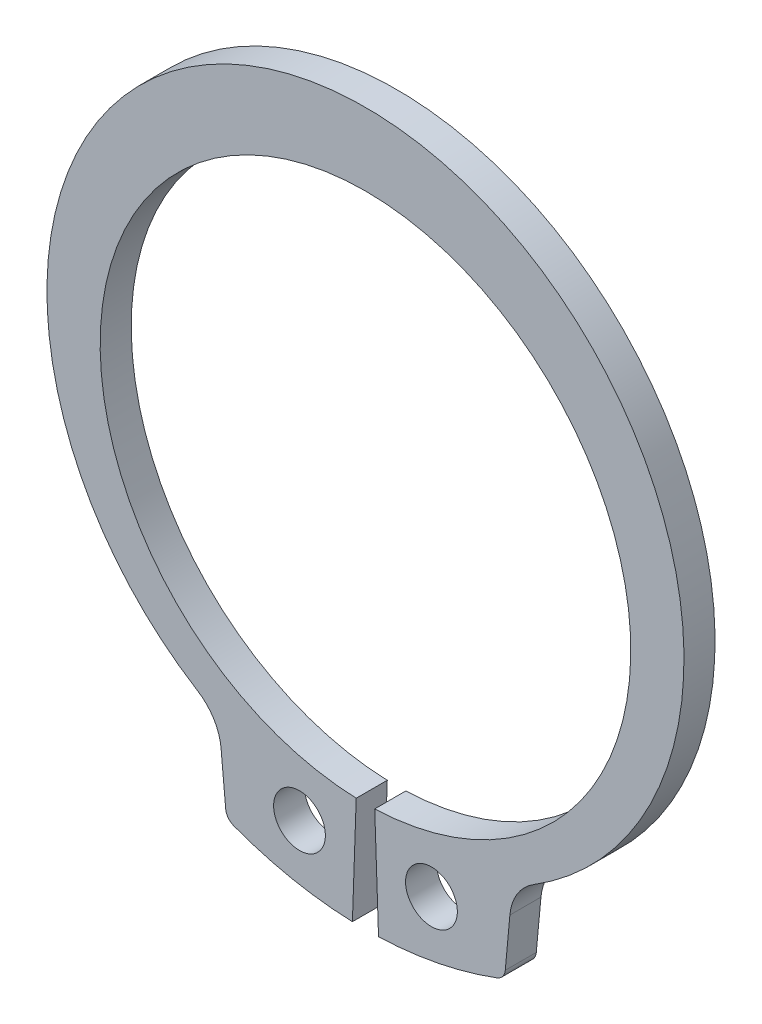
ISO-10303-21;
HEADER;
FILE_DESCRIPTION(('STEP AP214'),'2;1');
FILE_NAME('part.step','',(''),(''),'','','');
FILE_SCHEMA(('AUTOMOTIVE_DESIGN { 1 0 10303 214 1 1 1 1 }'));
ENDSEC;
DATA;
#1=APPLICATION_CONTEXT('core data for automotive mechanical design processes');
#2=APPLICATION_PROTOCOL_DEFINITION('international standard','automotive_design',2000,#1);
#3=PRODUCT_CONTEXT('',#1,'mechanical');
#4=PRODUCT('Part','Part','',(#3));
#5=PRODUCT_RELATED_PRODUCT_CATEGORY('part','',(#4));
#6=PRODUCT_DEFINITION_FORMATION('','',#4);
#7=PRODUCT_DEFINITION_CONTEXT('part definition',#1,'design');
#8=PRODUCT_DEFINITION('design','',#6,#7);
#9=PRODUCT_DEFINITION_SHAPE('','',#8);
#10=(LENGTH_UNIT() NAMED_UNIT(*) SI_UNIT(.MILLI.,.METRE.));
#11=(NAMED_UNIT(*) PLANE_ANGLE_UNIT() SI_UNIT($,.RADIAN.));
#12=(NAMED_UNIT(*) SI_UNIT($,.STERADIAN.) SOLID_ANGLE_UNIT());
#13=UNCERTAINTY_MEASURE_WITH_UNIT(LENGTH_MEASURE(1.E-05),#10,'distance_accuracy_value','');
#14=(GEOMETRIC_REPRESENTATION_CONTEXT(3) GLOBAL_UNCERTAINTY_ASSIGNED_CONTEXT((#13)) GLOBAL_UNIT_ASSIGNED_CONTEXT((#10,
#11,#12)) REPRESENTATION_CONTEXT('',''));
#15=CARTESIAN_POINT('',(0.,0.,0.));
#16=DIRECTION('',(0.,0.,1.));
#17=DIRECTION('',(1.,0.,0.));
#18=AXIS2_PLACEMENT_3D('',#15,#16,#17);
#19=CARTESIAN_POINT('',(0.,0.744411940032271,0.6));
#20=DIRECTION('',(0.,0.,1.));
#21=DIRECTION('',(1.,0.,0.));
#22=AXIS2_PLACEMENT_3D('',#19,#20,#21);
#23=PLANE('',#22);
#24=DIRECTION('',(0.0915748319668036,-0.995798197503014,0.));
#25=VECTOR('',#24,1.);
#26=CARTESIAN_POINT('',(-5.37268796446974,-13.4235371777606,0.6));
#27=LINE('',#26,#25);
#28=CARTESIAN_POINT('',(-5.57851751730511,-11.185316333625,0.6));
#29=VERTEX_POINT('',#28);
#30=CARTESIAN_POINT('',(-5.40026241330544,-13.1236885637039,0.6));
#31=VERTEX_POINT('',#30);
#32=EDGE_CURVE('E218',#29,#31,#27,.T.);
#33=ORIENTED_EDGE('',*,*,#32,.T.);
#34=CARTESIAN_POINT('',(-4.91603415482012,-13.0791583350736,0.6));
#35=DIRECTION('',(0.,0.,1.));
#36=DIRECTION('',(1.,0.,0.));
#37=AXIS2_PLACEMENT_3D('',#34,#35,#36);
#38=CIRCLE('',#37,0.486271475183956);
#39=CARTESIAN_POINT('',(-5.08712171582207,-13.5343385126385,0.6));
#40=VERTEX_POINT('',#39);
#41=EDGE_CURVE('E12',#31,#40,#38,.T.);
#42=ORIENTED_EDGE('',*,*,#41,.T.);
#43=CARTESIAN_POINT('',(0.,0.,0.6));
#44=DIRECTION('',(0.,0.,1.));
#45=DIRECTION('',(1.,0.,0.));
#46=AXIS2_PLACEMENT_3D('',#43,#44,#45);
#47=CIRCLE('',#46,14.458807915118);
#48=CARTESIAN_POINT('',(-0.504605119155777,-14.45,0.6));
#49=VERTEX_POINT('',#48);
#50=EDGE_CURVE('E222',#40,#49,#47,.T.);
#51=ORIENTED_EDGE('',*,*,#50,.T.);
#52=DIRECTION('',(0.0348994967025028,0.999390827019096,0.));
#53=VECTOR('',#52,1.);
#54=CARTESIAN_POINT('',(-0.504605119155777,-14.45,0.6));
#55=LINE('',#54,#53);
#56=CARTESIAN_POINT('',(-0.357719841200651,-10.2437559769457,0.6));
#57=VERTEX_POINT('',#56);
#58=EDGE_CURVE('E225',#49,#57,#55,.T.);
#59=ORIENTED_EDGE('',*,*,#58,.T.);
#60=CARTESIAN_POINT('',(0.,0.,0.6));
#61=DIRECTION('',(0.,0.,-1.));
#62=DIRECTION('',(1.,0.,0.));
#63=AXIS2_PLACEMENT_3D('',#60,#61,#62);
#64=CIRCLE('',#63,10.25);
#65=CARTESIAN_POINT('',(0.357719841200645,-10.2437559769457,0.6));
#66=VERTEX_POINT('',#65);
#67=EDGE_CURVE('E160',#57,#66,#64,.T.);
#68=ORIENTED_EDGE('',*,*,#67,.T.);
#69=DIRECTION('',(-0.0348994967025023,0.999390827019096,0.));
#70=VECTOR('',#69,1.);
#71=CARTESIAN_POINT('',(0.50460511915577,-14.45,0.6));
#72=LINE('',#71,#70);
#73=CARTESIAN_POINT('',(0.50460511915577,-14.45,0.6));
#74=VERTEX_POINT('',#73);
#75=EDGE_CURVE('E138',#74,#66,#72,.T.);
#76=ORIENTED_EDGE('',*,*,#75,.F.);
#77=CARTESIAN_POINT('',(0.,0.,0.6));
#78=DIRECTION('',(0.,0.,-1.));
#79=DIRECTION('',(-1.,0.,0.));
#80=AXIS2_PLACEMENT_3D('',#77,#78,#79);
#81=CIRCLE('',#80,14.458807915118);
#82=CARTESIAN_POINT('',(5.08712171582206,-13.5343385126385,0.6));
#83=VERTEX_POINT('',#82);
#84=EDGE_CURVE('E149',#83,#74,#81,.T.);
#85=ORIENTED_EDGE('',*,*,#84,.F.);
#86=CARTESIAN_POINT('',(4.91603415482012,-13.0791583350736,0.6));
#87=DIRECTION('',(0.,0.,-1.));
#88=DIRECTION('',(-1.,0.,0.));
#89=AXIS2_PLACEMENT_3D('',#86,#87,#88);
#90=CIRCLE('',#89,0.486271475183956);
#91=CARTESIAN_POINT('',(5.40026241330543,-13.1236885637039,0.6));
#92=VERTEX_POINT('',#91);
#93=EDGE_CURVE('E202',#92,#83,#90,.T.);
#94=ORIENTED_EDGE('',*,*,#93,.F.);
#95=DIRECTION('',(-0.0915748319668042,-0.995798197503014,0.));
#96=VECTOR('',#95,1.);
#97=CARTESIAN_POINT('',(5.37268796446974,-13.4235371777606,0.6));
#98=LINE('',#97,#96);
#99=CARTESIAN_POINT('',(5.5785175173051,-11.185316333625,0.6));
#100=VERTEX_POINT('',#99);
#101=EDGE_CURVE('E156',#100,#92,#98,.T.);
#102=ORIENTED_EDGE('',*,*,#101,.F.);
#103=CARTESIAN_POINT('',(7.51543055124636,-11.3634372481459,0.6));
#104=DIRECTION('',(0.,0.,-1.));
#105=DIRECTION('',(-1.,0.,0.));
#106=AXIS2_PLACEMENT_3D('',#103,#104,#105);
#107=CIRCLE('',#106,1.94508590073582);
#108=CARTESIAN_POINT('',(6.48964341700286,-9.71082721657109,0.6));
#109=VERTEX_POINT('',#108);
#110=EDGE_CURVE('E189',#109,#100,#107,.F.);
#111=ORIENTED_EDGE('',*,*,#110,.F.);
#112=CARTESIAN_POINT('',(0.,0.744411940032271,0.6));
#113=DIRECTION('',(0.,0.,1.));
#114=DIRECTION('',(1.,0.,0.));
#115=AXIS2_PLACEMENT_3D('',#112,#113,#114);
#116=CIRCLE('',#115,12.3055880599677);
#117=CARTESIAN_POINT('',(-6.48964341700287,-9.71082721657108,0.6));
#118=VERTEX_POINT('',#117);
#119=EDGE_CURVE('E214',#109,#118,#116,.T.);
#120=ORIENTED_EDGE('',*,*,#119,.T.);
#121=CARTESIAN_POINT('',(-7.51543055124637,-11.3634372481459,0.6));
#122=DIRECTION('',(0.,0.,1.));
#123=DIRECTION('',(1.,0.,0.));
#124=AXIS2_PLACEMENT_3D('',#121,#122,#123);
#125=CIRCLE('',#124,1.94508590073582);
#126=EDGE_CURVE('E262',#118,#29,#125,.F.);
#127=ORIENTED_EDGE('',*,*,#126,.T.);
#128=EDGE_LOOP('',(#33,#42,#51,#59,#68,#76,#85,#94,#102,#111,#120,#127));
#129=FACE_BOUND('',#128,.T.);
#130=CARTESIAN_POINT('',(-2.54894891922943,-12.0885961365954,0.6));
#131=DIRECTION('',(0.,0.,1.));
#132=DIRECTION('',(1.,0.,0.));
#133=AXIS2_PLACEMENT_3D('',#130,#131,#132);
#134=CIRCLE('',#133,1.);
#135=CARTESIAN_POINT('',(-1.54894891922942,-12.0885961365954,0.6));
#136=VERTEX_POINT('',#135);
#137=EDGE_CURVE('E206',#136,#136,#134,.T.);
#138=ORIENTED_EDGE('',*,*,#137,.F.);
#139=EDGE_LOOP('',(#138));
#140=FACE_BOUND('',#139,.T.);
#141=CARTESIAN_POINT('',(2.54894891922942,-12.0885961365954,0.6));
#142=DIRECTION('',(0.,0.,-1.));
#143=DIRECTION('',(-1.,0.,0.));
#144=AXIS2_PLACEMENT_3D('',#141,#142,#143);
#145=CIRCLE('',#144,1.);
#146=CARTESIAN_POINT('',(1.54894891922942,-12.0885961365954,0.6));
#147=VERTEX_POINT('',#146);
#148=EDGE_CURVE('E174',#147,#147,#145,.T.);
#149=ORIENTED_EDGE('',*,*,#148,.T.);
#150=EDGE_LOOP('',(#149));
#151=FACE_BOUND('',#150,.T.);
#152=ADVANCED_FACE('F43',(#129,#140,#151),#23,.T.);
#153=CARTESIAN_POINT('',(0.,0.744411940032271,-0.6));
#154=DIRECTION('',(0.,0.,1.));
#155=DIRECTION('',(1.,0.,0.));
#156=AXIS2_PLACEMENT_3D('',#153,#154,#155);
#157=PLANE('',#156);
#158=CARTESIAN_POINT('',(0.,0.,-0.6));
#159=DIRECTION('',(0.,0.,1.));
#160=DIRECTION('',(1.,0.,0.));
#161=AXIS2_PLACEMENT_3D('',#158,#159,#160);
#162=CIRCLE('',#161,14.458807915118);
#163=CARTESIAN_POINT('',(-5.08712171582207,-13.5343385126385,-0.6));
#164=VERTEX_POINT('',#163);
#165=CARTESIAN_POINT('',(-0.504605119155777,-14.45,-0.6));
#166=VERTEX_POINT('',#165);
#167=EDGE_CURVE('E237',#164,#166,#162,.T.);
#168=ORIENTED_EDGE('',*,*,#167,.F.);
#169=CARTESIAN_POINT('',(-4.91603415482012,-13.0791583350736,-0.6));
#170=DIRECTION('',(0.,0.,1.));
#171=DIRECTION('',(1.,0.,0.));
#172=AXIS2_PLACEMENT_3D('',#169,#170,#171);
#173=CIRCLE('',#172,0.486271475183956);
#174=CARTESIAN_POINT('',(-5.40026241330544,-13.1236885637039,-0.6));
#175=VERTEX_POINT('',#174);
#176=EDGE_CURVE('E66',#164,#175,#173,.F.);
#177=ORIENTED_EDGE('',*,*,#176,.T.);
#178=DIRECTION('',(0.0915748319668036,-0.995798197503014,0.));
#179=VECTOR('',#178,1.);
#180=CARTESIAN_POINT('',(-5.37268796446974,-13.4235371777606,-0.6));
#181=LINE('',#180,#179);
#182=CARTESIAN_POINT('',(-5.57851751730511,-11.185316333625,-0.6));
#183=VERTEX_POINT('',#182);
#184=EDGE_CURVE('E234',#183,#175,#181,.T.);
#185=ORIENTED_EDGE('',*,*,#184,.F.);
#186=CARTESIAN_POINT('',(-7.51543055124637,-11.3634372481459,-0.6));
#187=DIRECTION('',(0.,0.,1.));
#188=DIRECTION('',(1.,0.,0.));
#189=AXIS2_PLACEMENT_3D('',#186,#187,#188);
#190=CIRCLE('',#189,1.94508590073582);
#191=CARTESIAN_POINT('',(-6.48964341700287,-9.71082721657108,-0.6));
#192=VERTEX_POINT('',#191);
#193=EDGE_CURVE('E259',#183,#192,#190,.T.);
#194=ORIENTED_EDGE('',*,*,#193,.T.);
#195=CARTESIAN_POINT('',(0.,0.744411940032271,-0.6));
#196=DIRECTION('',(0.,0.,1.));
#197=DIRECTION('',(1.,0.,0.));
#198=AXIS2_PLACEMENT_3D('',#195,#196,#197);
#199=CIRCLE('',#198,12.3055880599677);
#200=CARTESIAN_POINT('',(6.48964341700286,-9.71082721657109,-0.6));
#201=VERTEX_POINT('',#200);
#202=EDGE_CURVE('E210',#201,#192,#199,.T.);
#203=ORIENTED_EDGE('',*,*,#202,.F.);
#204=CARTESIAN_POINT('',(7.51543055124636,-11.3634372481459,-0.6));
#205=DIRECTION('',(0.,0.,-1.));
#206=DIRECTION('',(-1.,0.,0.));
#207=AXIS2_PLACEMENT_3D('',#204,#205,#206);
#208=CIRCLE('',#207,1.94508590073582);
#209=CARTESIAN_POINT('',(5.5785175173051,-11.185316333625,-0.6));
#210=VERTEX_POINT('',#209);
#211=EDGE_CURVE('E185',#210,#201,#208,.T.);
#212=ORIENTED_EDGE('',*,*,#211,.F.);
#213=DIRECTION('',(-0.0915748319668042,-0.995798197503014,0.));
#214=VECTOR('',#213,1.);
#215=CARTESIAN_POINT('',(5.37268796446974,-13.4235371777606,-0.6));
#216=LINE('',#215,#214);
#217=CARTESIAN_POINT('',(5.40026241330543,-13.1236885637039,-0.6));
#218=VERTEX_POINT('',#217);
#219=EDGE_CURVE('E169',#210,#218,#216,.T.);
#220=ORIENTED_EDGE('',*,*,#219,.T.);
#221=CARTESIAN_POINT('',(4.91603415482012,-13.0791583350736,-0.6));
#222=DIRECTION('',(0.,0.,-1.));
#223=DIRECTION('',(-1.,0.,0.));
#224=AXIS2_PLACEMENT_3D('',#221,#222,#223);
#225=CIRCLE('',#224,0.486271475183956);
#226=CARTESIAN_POINT('',(5.08712171582206,-13.5343385126385,-0.6));
#227=VERTEX_POINT('',#226);
#228=EDGE_CURVE('E195',#227,#218,#225,.F.);
#229=ORIENTED_EDGE('',*,*,#228,.F.);
#230=CARTESIAN_POINT('',(0.,0.,-0.6));
#231=DIRECTION('',(0.,0.,-1.));
#232=DIRECTION('',(-1.,0.,0.));
#233=AXIS2_PLACEMENT_3D('',#230,#231,#232);
#234=CIRCLE('',#233,14.458807915118);
#235=CARTESIAN_POINT('',(0.50460511915577,-14.45,-0.6));
#236=VERTEX_POINT('',#235);
#237=EDGE_CURVE('E173',#227,#236,#234,.T.);
#238=ORIENTED_EDGE('',*,*,#237,.T.);
#239=DIRECTION('',(-0.0348994967025023,0.999390827019096,0.));
#240=VECTOR('',#239,1.);
#241=CARTESIAN_POINT('',(0.50460511915577,-14.45,-0.6));
#242=LINE('',#241,#240);
#243=CARTESIAN_POINT('',(0.357719841200645,-10.2437559769457,-0.6));
#244=VERTEX_POINT('',#243);
#245=EDGE_CURVE('E140',#236,#244,#242,.T.);
#246=ORIENTED_EDGE('',*,*,#245,.T.);
#247=CARTESIAN_POINT('',(0.,0.,-0.6));
#248=DIRECTION('',(0.,0.,-1.));
#249=DIRECTION('',(1.,0.,0.));
#250=AXIS2_PLACEMENT_3D('',#247,#248,#249);
#251=CIRCLE('',#250,10.25);
#252=CARTESIAN_POINT('',(-0.357719841200651,-10.2437559769457,-0.6));
#253=VERTEX_POINT('',#252);
#254=EDGE_CURVE('E219',#253,#244,#251,.T.);
#255=ORIENTED_EDGE('',*,*,#254,.F.);
#256=DIRECTION('',(0.0348994967025028,0.999390827019096,0.));
#257=VECTOR('',#256,1.);
#258=CARTESIAN_POINT('',(-0.504605119155777,-14.45,-0.6));
#259=LINE('',#258,#257);
#260=EDGE_CURVE('E240',#166,#253,#259,.T.);
#261=ORIENTED_EDGE('',*,*,#260,.F.);
#262=EDGE_LOOP('',(#168,#177,#185,#194,#203,#212,#220,#229,#238,#246,#255,#261));
#263=FACE_BOUND('',#262,.T.);
#264=CARTESIAN_POINT('',(-2.54894891922943,-12.0885961365954,-0.6));
#265=DIRECTION('',(0.,0.,1.));
#266=DIRECTION('',(1.,0.,0.));
#267=AXIS2_PLACEMENT_3D('',#264,#265,#266);
#268=CIRCLE('',#267,1.);
#269=CARTESIAN_POINT('',(-1.54894891922942,-12.0885961365954,-0.6));
#270=VERTEX_POINT('',#269);
#271=EDGE_CURVE('E205',#270,#270,#268,.T.);
#272=ORIENTED_EDGE('',*,*,#271,.T.);
#273=EDGE_LOOP('',(#272));
#274=FACE_BOUND('',#273,.T.);
#275=CARTESIAN_POINT('',(2.54894891922942,-12.0885961365954,-0.6));
#276=DIRECTION('',(0.,0.,-1.));
#277=DIRECTION('',(-1.,0.,0.));
#278=AXIS2_PLACEMENT_3D('',#275,#276,#277);
#279=CIRCLE('',#278,1.);
#280=CARTESIAN_POINT('',(1.54894891922942,-12.0885961365954,-0.6));
#281=VERTEX_POINT('',#280);
#282=EDGE_CURVE('E333',#281,#281,#279,.T.);
#283=ORIENTED_EDGE('',*,*,#282,.F.);
#284=EDGE_LOOP('',(#283));
#285=FACE_BOUND('',#284,.T.);
#286=ADVANCED_FACE('F311',(#263,#274,#285),#157,.F.);
#287=CARTESIAN_POINT('',(0.,0.744411940032271,0.6));
#288=DIRECTION('',(0.,0.,-1.));
#289=DIRECTION('',(-1.,0.,0.));
#290=AXIS2_PLACEMENT_3D('',#287,#288,#289);
#291=CYLINDRICAL_SURFACE('',#290,12.3055880599677);
#292=ORIENTED_EDGE('',*,*,#202,.T.);
#293=DIRECTION('',(0.,0.,-1.));
#294=VECTOR('',#293,1.);
#295=CARTESIAN_POINT('',(-6.48964341700287,-9.71082721657108,0.6));
#296=LINE('',#295,#294);
#297=EDGE_CURVE('E256',#192,#118,#296,.F.);
#298=ORIENTED_EDGE('',*,*,#297,.T.);
#299=ORIENTED_EDGE('',*,*,#119,.F.);
#300=DIRECTION('',(0.,0.,-1.));
#301=VECTOR('',#300,1.);
#302=CARTESIAN_POINT('',(6.48964341700286,-9.71082721657109,0.6));
#303=LINE('',#302,#301);
#304=EDGE_CURVE('E181',#201,#109,#303,.F.);
#305=ORIENTED_EDGE('',*,*,#304,.F.);
#306=EDGE_LOOP('',(#292,#298,#299,#305));
#307=FACE_BOUND('',#306,.T.);
#308=ADVANCED_FACE('F351',(#307),#291,.T.);
#309=CARTESIAN_POINT('',(-5.37268796446974,-13.4235371777606,0.6));
#310=DIRECTION('',(0.995798197503014,0.0915748319668036,0.));
#311=DIRECTION('',(-0.0915748319668036,0.995798197503014,0.));
#312=AXIS2_PLACEMENT_3D('',#309,#310,#311);
#313=PLANE('',#312);
#314=ORIENTED_EDGE('',*,*,#184,.T.);
#315=DIRECTION('',(0.,0.,-1.));
#316=VECTOR('',#315,1.);
#317=CARTESIAN_POINT('',(-5.40026241330544,-13.1236885637039,0.6));
#318=LINE('',#317,#316);
#319=EDGE_CURVE('E52',#175,#31,#318,.F.);
#320=ORIENTED_EDGE('',*,*,#319,.T.);
#321=ORIENTED_EDGE('',*,*,#32,.F.);
#322=DIRECTION('',(0.,0.,1.));
#323=VECTOR('',#322,1.);
#324=CARTESIAN_POINT('',(-5.57851751730511,-11.185316333625,-0.6));
#325=LINE('',#324,#323);
#326=EDGE_CURVE('E252',#29,#183,#325,.F.);
#327=ORIENTED_EDGE('',*,*,#326,.T.);
#328=EDGE_LOOP('',(#314,#320,#321,#327));
#329=FACE_BOUND('',#328,.T.);
#330=ADVANCED_FACE('F357',(#329),#313,.F.);
#331=CARTESIAN_POINT('',(0.,0.,0.6));
#332=DIRECTION('',(0.,0.,-1.));
#333=DIRECTION('',(-1.,0.,0.));
#334=AXIS2_PLACEMENT_3D('',#331,#332,#333);
#335=CYLINDRICAL_SURFACE('',#334,14.458807915118);
#336=ORIENTED_EDGE('',*,*,#50,.F.);
#337=DIRECTION('',(0.,0.,-1.));
#338=VECTOR('',#337,1.);
#339=CARTESIAN_POINT('',(-5.08712171582207,-13.5343385126385,0.6));
#340=LINE('',#339,#338);
#341=EDGE_CURVE('E265',#40,#164,#340,.T.);
#342=ORIENTED_EDGE('',*,*,#341,.T.);
#343=ORIENTED_EDGE('',*,*,#167,.T.);
#344=DIRECTION('',(0.,0.,-1.));
#345=VECTOR('',#344,1.);
#346=CARTESIAN_POINT('',(-0.504605119155777,-14.45,0.6));
#347=LINE('',#346,#345);
#348=EDGE_CURVE('E248',#49,#166,#347,.T.);
#349=ORIENTED_EDGE('',*,*,#348,.F.);
#350=EDGE_LOOP('',(#336,#342,#343,#349));
#351=FACE_BOUND('',#350,.T.);
#352=ADVANCED_FACE('F306',(#351),#335,.T.);
#353=CARTESIAN_POINT('',(-0.504605119155777,-14.45,0.6));
#354=DIRECTION('',(-0.999390827019096,0.0348994967025028,0.));
#355=DIRECTION('',(-0.0348994967025028,-0.999390827019096,0.));
#356=AXIS2_PLACEMENT_3D('',#353,#354,#355);
#357=PLANE('',#356);
#358=ORIENTED_EDGE('',*,*,#260,.T.);
#359=DIRECTION('',(0.,0.,-1.));
#360=VECTOR('',#359,1.);
#361=CARTESIAN_POINT('',(-0.357719841200651,-10.2437559769457,0.6));
#362=LINE('',#361,#360);
#363=EDGE_CURVE('E230',#57,#253,#362,.T.);
#364=ORIENTED_EDGE('',*,*,#363,.F.);
#365=ORIENTED_EDGE('',*,*,#58,.F.);
#366=ORIENTED_EDGE('',*,*,#348,.T.);
#367=EDGE_LOOP('',(#358,#364,#365,#366));
#368=FACE_BOUND('',#367,.T.);
#369=ADVANCED_FACE('F316',(#368),#357,.F.);
#370=CARTESIAN_POINT('',(0.,0.,0.6));
#371=DIRECTION('',(0.,0.,-1.));
#372=DIRECTION('',(-1.,0.,0.));
#373=AXIS2_PLACEMENT_3D('',#370,#371,#372);
#374=CYLINDRICAL_SURFACE('',#373,10.25);
#375=ORIENTED_EDGE('',*,*,#254,.T.);
#376=DIRECTION('',(0.,0.,-1.));
#377=VECTOR('',#376,1.);
#378=CARTESIAN_POINT('',(0.357719841200645,-10.2437559769457,0.6));
#379=LINE('',#378,#377);
#380=EDGE_CURVE('E146',#66,#244,#379,.T.);
#381=ORIENTED_EDGE('',*,*,#380,.F.);
#382=ORIENTED_EDGE('',*,*,#67,.F.);
#383=ORIENTED_EDGE('',*,*,#363,.T.);
#384=EDGE_LOOP('',(#375,#381,#382,#383));
#385=FACE_BOUND('',#384,.T.);
#386=ADVANCED_FACE('F319',(#385),#374,.F.);
#387=CARTESIAN_POINT('',(-2.54894891922943,-12.0885961365954,0.6));
#388=DIRECTION('',(0.,0.,-1.));
#389=DIRECTION('',(-1.,0.,0.));
#390=AXIS2_PLACEMENT_3D('',#387,#388,#389);
#391=CYLINDRICAL_SURFACE('',#390,1.);
#392=ORIENTED_EDGE('',*,*,#137,.T.);
#393=EDGE_LOOP('',(#392));
#394=FACE_BOUND('',#393,.T.);
#395=ORIENTED_EDGE('',*,*,#271,.F.);
#396=EDGE_LOOP('',(#395));
#397=FACE_BOUND('',#396,.T.);
#398=ADVANCED_FACE('F365',(#394,#397),#391,.F.);
#399=CARTESIAN_POINT('',(-7.51543055124637,-11.3634372481459,0.6));
#400=DIRECTION('',(0.,0.,-1.));
#401=DIRECTION('',(-1.,0.,0.));
#402=AXIS2_PLACEMENT_3D('',#399,#400,#401);
#403=CYLINDRICAL_SURFACE('',#402,1.94508590073582);
#404=ORIENTED_EDGE('',*,*,#126,.F.);
#405=ORIENTED_EDGE('',*,*,#297,.F.);
#406=ORIENTED_EDGE('',*,*,#193,.F.);
#407=ORIENTED_EDGE('',*,*,#326,.F.);
#408=EDGE_LOOP('',(#404,#405,#406,#407));
#409=FACE_BOUND('',#408,.T.);
#410=ADVANCED_FACE('F371',(#409),#403,.F.);
#411=CARTESIAN_POINT('',(-4.91603415482012,-13.0791583350736,0.6));
#412=DIRECTION('',(0.,0.,-1.));
#413=DIRECTION('',(-1.,0.,0.));
#414=AXIS2_PLACEMENT_3D('',#411,#412,#413);
#415=CYLINDRICAL_SURFACE('',#414,0.486271475183956);
#416=ORIENTED_EDGE('',*,*,#41,.F.);
#417=ORIENTED_EDGE('',*,*,#319,.F.);
#418=ORIENTED_EDGE('',*,*,#176,.F.);
#419=ORIENTED_EDGE('',*,*,#341,.F.);
#420=EDGE_LOOP('',(#416,#417,#418,#419));
#421=FACE_BOUND('',#420,.T.);
#422=ADVANCED_FACE('F45',(#421),#415,.T.);
#423=CARTESIAN_POINT('',(5.37268796446974,-13.4235371777606,0.6));
#424=DIRECTION('',(-0.995798197503014,0.0915748319668042,0.));
#425=DIRECTION('',(0.0915748319668042,0.995798197503014,0.));
#426=AXIS2_PLACEMENT_3D('',#423,#424,#425);
#427=PLANE('',#426);
#428=ORIENTED_EDGE('',*,*,#219,.F.);
#429=DIRECTION('',(0.,0.,1.));
#430=VECTOR('',#429,1.);
#431=CARTESIAN_POINT('',(5.5785175173051,-11.185316333625,-0.6));
#432=LINE('',#431,#430);
#433=EDGE_CURVE('E145',#100,#210,#432,.F.);
#434=ORIENTED_EDGE('',*,*,#433,.F.);
#435=ORIENTED_EDGE('',*,*,#101,.T.);
#436=DIRECTION('',(0.,0.,-1.));
#437=VECTOR('',#436,1.);
#438=CARTESIAN_POINT('',(5.40026241330543,-13.1236885637039,0.6));
#439=LINE('',#438,#437);
#440=EDGE_CURVE('E199',#218,#92,#439,.F.);
#441=ORIENTED_EDGE('',*,*,#440,.F.);
#442=EDGE_LOOP('',(#428,#434,#435,#441));
#443=FACE_BOUND('',#442,.T.);
#444=ADVANCED_FACE('F329',(#443),#427,.F.);
#445=CARTESIAN_POINT('',(0.,0.,0.6));
#446=DIRECTION('',(0.,0.,-1.));
#447=DIRECTION('',(1.,0.,0.));
#448=AXIS2_PLACEMENT_3D('',#445,#446,#447);
#449=CYLINDRICAL_SURFACE('',#448,14.458807915118);
#450=ORIENTED_EDGE('',*,*,#84,.T.);
#451=DIRECTION('',(0.,0.,-1.));
#452=VECTOR('',#451,1.);
#453=CARTESIAN_POINT('',(0.50460511915577,-14.45,0.6));
#454=LINE('',#453,#452);
#455=EDGE_CURVE('E133',#74,#236,#454,.T.);
#456=ORIENTED_EDGE('',*,*,#455,.T.);
#457=ORIENTED_EDGE('',*,*,#237,.F.);
#458=DIRECTION('',(0.,0.,-1.));
#459=VECTOR('',#458,1.);
#460=CARTESIAN_POINT('',(5.08712171582206,-13.5343385126385,0.6));
#461=LINE('',#460,#459);
#462=EDGE_CURVE('E151',#83,#227,#461,.T.);
#463=ORIENTED_EDGE('',*,*,#462,.F.);
#464=EDGE_LOOP('',(#450,#456,#457,#463));
#465=FACE_BOUND('',#464,.T.);
#466=ADVANCED_FACE('F150',(#465),#449,.T.);
#467=CARTESIAN_POINT('',(0.50460511915577,-14.45,0.6));
#468=DIRECTION('',(0.999390827019096,0.0348994967025023,0.));
#469=DIRECTION('',(0.0348994967025023,-0.999390827019096,0.));
#470=AXIS2_PLACEMENT_3D('',#467,#468,#469);
#471=PLANE('',#470);
#472=ORIENTED_EDGE('',*,*,#245,.F.);
#473=ORIENTED_EDGE('',*,*,#455,.F.);
#474=ORIENTED_EDGE('',*,*,#75,.T.);
#475=ORIENTED_EDGE('',*,*,#380,.T.);
#476=EDGE_LOOP('',(#472,#473,#474,#475));
#477=FACE_BOUND('',#476,.T.);
#478=ADVANCED_FACE('F135',(#477),#471,.F.);
#479=CARTESIAN_POINT('',(2.54894891922942,-12.0885961365954,0.6));
#480=DIRECTION('',(0.,0.,-1.));
#481=DIRECTION('',(1.,0.,0.));
#482=AXIS2_PLACEMENT_3D('',#479,#480,#481);
#483=CYLINDRICAL_SURFACE('',#482,1.);
#484=ORIENTED_EDGE('',*,*,#148,.F.);
#485=EDGE_LOOP('',(#484));
#486=FACE_BOUND('',#485,.T.);
#487=ORIENTED_EDGE('',*,*,#282,.T.);
#488=EDGE_LOOP('',(#487));
#489=FACE_BOUND('',#488,.T.);
#490=ADVANCED_FACE('F343',(#486,#489),#483,.F.);
#491=CARTESIAN_POINT('',(7.51543055124636,-11.3634372481459,0.6));
#492=DIRECTION('',(0.,0.,-1.));
#493=DIRECTION('',(1.,0.,0.));
#494=AXIS2_PLACEMENT_3D('',#491,#492,#493);
#495=CYLINDRICAL_SURFACE('',#494,1.94508590073582);
#496=ORIENTED_EDGE('',*,*,#110,.T.);
#497=ORIENTED_EDGE('',*,*,#433,.T.);
#498=ORIENTED_EDGE('',*,*,#211,.T.);
#499=ORIENTED_EDGE('',*,*,#304,.T.);
#500=EDGE_LOOP('',(#496,#497,#498,#499));
#501=FACE_BOUND('',#500,.T.);
#502=ADVANCED_FACE('F346',(#501),#495,.F.);
#503=CARTESIAN_POINT('',(4.91603415482012,-13.0791583350736,0.6));
#504=DIRECTION('',(0.,0.,-1.));
#505=DIRECTION('',(1.,0.,0.));
#506=AXIS2_PLACEMENT_3D('',#503,#504,#505);
#507=CYLINDRICAL_SURFACE('',#506,0.486271475183956);
#508=ORIENTED_EDGE('',*,*,#93,.T.);
#509=ORIENTED_EDGE('',*,*,#462,.T.);
#510=ORIENTED_EDGE('',*,*,#228,.T.);
#511=ORIENTED_EDGE('',*,*,#440,.T.);
#512=EDGE_LOOP('',(#508,#509,#510,#511));
#513=FACE_BOUND('',#512,.T.);
#514=ADVANCED_FACE('F324',(#513),#507,.T.);
#515=CLOSED_SHELL('',(#152,#286,#308,#330,#352,#369,#386,#398,#410,#422,#444,#466,#478,#490,
#502,#514));
#516=MANIFOLD_SOLID_BREP('B2',#515);
#517=ADVANCED_BREP_SHAPE_REPRESENTATION('',(#18,#516),#14);
#518=SHAPE_DEFINITION_REPRESENTATION(#9,#517);
ENDSEC;
END-ISO-10303-21;
